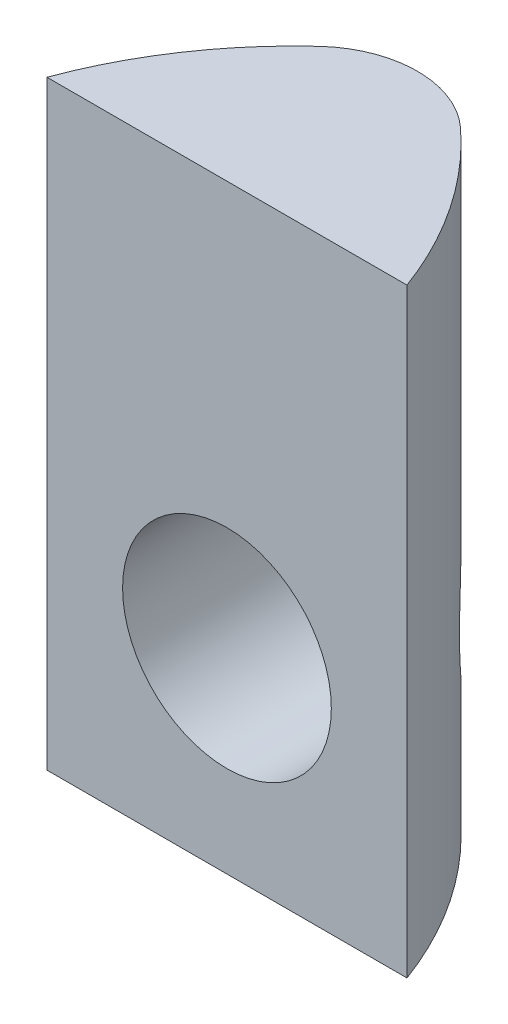
ISO-10303-21;
HEADER;
FILE_DESCRIPTION(('STEP AP214'),'2;1');
FILE_NAME('part.step','',(''),(''),'','','');
FILE_SCHEMA(('AUTOMOTIVE_DESIGN { 1 0 10303 214 1 1 1 1 }'));
ENDSEC;
DATA;
#1=APPLICATION_CONTEXT('core data for automotive mechanical design processes');
#2=APPLICATION_PROTOCOL_DEFINITION('international standard','automotive_design',2000,#1);
#3=PRODUCT_CONTEXT('',#1,'mechanical');
#4=PRODUCT('Part','Part','',(#3));
#5=PRODUCT_RELATED_PRODUCT_CATEGORY('part','',(#4));
#6=PRODUCT_DEFINITION_FORMATION('','',#4);
#7=PRODUCT_DEFINITION_CONTEXT('part definition',#1,'design');
#8=PRODUCT_DEFINITION('design','',#6,#7);
#9=PRODUCT_DEFINITION_SHAPE('','',#8);
#10=(LENGTH_UNIT() NAMED_UNIT(*) SI_UNIT(.MILLI.,.METRE.));
#11=(NAMED_UNIT(*) PLANE_ANGLE_UNIT() SI_UNIT($,.RADIAN.));
#12=(NAMED_UNIT(*) SI_UNIT($,.STERADIAN.) SOLID_ANGLE_UNIT());
#13=UNCERTAINTY_MEASURE_WITH_UNIT(LENGTH_MEASURE(1.E-05),#10,'distance_accuracy_value','');
#14=(GEOMETRIC_REPRESENTATION_CONTEXT(3) GLOBAL_UNCERTAINTY_ASSIGNED_CONTEXT((#13)) GLOBAL_UNIT_ASSIGNED_CONTEXT((#10,
#11,#12)) REPRESENTATION_CONTEXT('',''));
#15=CARTESIAN_POINT('',(0.,0.,0.));
#16=DIRECTION('',(0.,0.,1.));
#17=DIRECTION('',(1.,0.,0.));
#18=AXIS2_PLACEMENT_3D('',#15,#16,#17);
#19=CARTESIAN_POINT('',(8.10883938059988,15.5,5.54738866054847));
#20=DIRECTION('',(0.,-1.,0.));
#21=DIRECTION('',(0.,0.,-1.));
#22=AXIS2_PLACEMENT_3D('',#19,#20,#21);
#23=CYLINDRICAL_SURFACE('',#22,16.0012118447341);
#24=CARTESIAN_POINT('',(8.10883938059988,15.5,5.54738866054847));
#25=DIRECTION('',(0.,-1.,0.));
#26=DIRECTION('',(0.,0.,-1.));
#27=AXIS2_PLACEMENT_3D('',#24,#25,#26);
#28=CIRCLE('',#27,16.0012118447341);
#29=CARTESIAN_POINT('',(-6.89999999988221,15.5,2.10522700212147E-11));
#30=VERTEX_POINT('',#29);
#31=CARTESIAN_POINT('',(-2.70267351764021,15.5,-6.24879586459552));
#32=VERTEX_POINT('',#31);
#33=EDGE_CURVE('E93',#30,#32,#28,.T.);
#34=ORIENTED_EDGE('',*,*,#33,.T.);
#35=DIRECTION('',(0.,-1.,0.));
#36=VECTOR('',#35,1.);
#37=CARTESIAN_POINT('',(-2.70267351764021,15.5,-6.24879586459552));
#38=LINE('',#37,#36);
#39=CARTESIAN_POINT('',(-2.70267351764022,2.94882279173336,-6.24879586459551));
#40=VERTEX_POINT('',#39);
#41=EDGE_CURVE('E161',#32,#40,#38,.T.);
#42=ORIENTED_EDGE('',*,*,#41,.T.);
#43=CARTESIAN_POINT('',(-3.287340885616E-09,-3.99999999999999,-8.24701253509529));
#44=CARTESIAN_POINT('',(-0.147341921067703,-3.99999249556266,-8.16043426596502));
#45=CARTESIAN_POINT('',(-0.293194172534511,-3.9918615991455,-8.07148817515861));
#46=CARTESIAN_POINT('',(-0.580696965481446,-3.96026480061841,-7.88984953927804));
#47=CARTESIAN_POINT('',(-0.722350809706096,-3.9368113060517,-7.79716008233623));
#48=CARTESIAN_POINT('',(-1.00029883530273,-3.87551729821107,-7.6090010425852));
#49=CARTESIAN_POINT('',(-1.13659962608308,-3.83769518418507,-7.51353515880487));
#50=CARTESIAN_POINT('',(-1.40324218732139,-3.74842395350727,-7.32063936718334));
#51=CARTESIAN_POINT('',(-1.53358305059144,-3.69697277035562,-7.22320916357474));
#52=CARTESIAN_POINT('',(-1.77674876389576,-3.58601045103693,-7.03575307062682));
#53=CARTESIAN_POINT('',(-1.89011956544848,-3.52756045152293,-6.94580409882415));
#54=CARTESIAN_POINT('',(-2.11079342729062,-3.40011558193147,-6.76594331629057));
#55=CARTESIAN_POINT('',(-2.21809678630457,-3.33112123161506,-6.67603150394687));
#56=CARTESIAN_POINT('',(-2.42620312385422,-3.18274692400836,-6.4971323301391));
#57=CARTESIAN_POINT('',(-2.52700357875337,-3.10336297050493,-6.40814533868339));
#58=CARTESIAN_POINT('',(-2.72147885070942,-2.93430480702846,-6.23226315640392));
#59=CARTESIAN_POINT('',(-2.81515513763224,-2.8446327293423,-6.14536753662885));
#60=CARTESIAN_POINT('',(-3.04443761072605,-2.60242407760311,-5.92780254701866));
#61=CARTESIAN_POINT('',(-3.17462778683841,-2.44252019064399,-5.79946258878729));
#62=CARTESIAN_POINT('',(-3.41267299857621,-2.0970248129716,-5.55766491445157));
#63=CARTESIAN_POINT('',(-3.52057296167341,-1.91148627637457,-5.44417743484924));
#64=CARTESIAN_POINT('',(-3.68305772973307,-1.56863945444117,-5.26927161271409));
#65=CARTESIAN_POINT('',(-3.74416060049222,-1.41739001838378,-5.20208813334109));
#66=CARTESIAN_POINT('',(-3.84871930064445,-1.10216849180274,-5.0856605446179));
#67=CARTESIAN_POINT('',(-3.89219200823345,-0.938208749481262,-5.03639928214667));
#68=CARTESIAN_POINT('',(-3.94196270102343,-0.684484154814112,-4.9796042606764));
#69=CARTESIAN_POINT('',(-3.95601664566853,-0.59807070794513,-4.9634779726225));
#70=CARTESIAN_POINT('',(-3.97847894621796,-0.423584674575845,-4.93763944850119));
#71=CARTESIAN_POINT('',(-3.98689035766619,-0.335513012640703,-4.92792374102381));
#72=CARTESIAN_POINT('',(-3.99783807784642,-0.158563717540683,-4.91526941932273));
#73=CARTESIAN_POINT('',(-4.00037759980254,-0.0696865519107466,-4.91232709856013));
#74=CARTESIAN_POINT('',(-3.99953078801288,0.107972102444355,-4.91330653937735));
#75=CARTESIAN_POINT('',(-3.99614512181398,0.196753600820072,-4.91722752771918));
#76=CARTESIAN_POINT('',(-3.97913407580123,0.434612212886048,-4.93688524541506));
#77=CARTESIAN_POINT('',(-3.96003919269115,0.582844375345112,-4.95892647857697));
#78=CARTESIAN_POINT('',(-3.90643244429561,0.872705045045752,-5.02018576853696));
#79=CARTESIAN_POINT('',(-3.87191031971662,1.01432908848025,-5.05941525538217));
#80=CARTESIAN_POINT('',(-3.77418020538334,1.33940828735032,-5.16894359237582));
#81=CARTESIAN_POINT('',(-3.70508782346502,1.51901789428938,-5.24536542883216));
#82=CARTESIAN_POINT('',(-3.54645380233217,1.85961271460088,-5.41648420012362));
#83=CARTESIAN_POINT('',(-3.45686527416673,2.02055392802518,-5.51122296031448));
#84=CARTESIAN_POINT('',(-3.28984447592442,2.27883518542387,-5.68286785386482));
#85=CARTESIAN_POINT('',(-3.21659816751849,2.38095041640104,-5.75681277118879));
#86=CARTESIAN_POINT('',(-3.06262544898029,2.57599932918617,-5.90900096775918));
#87=CARTESIAN_POINT('',(-2.98189602878847,2.66892928491475,-5.98724597150533));
#88=CARTESIAN_POINT('',(-2.81359499999945,2.84580404954932,-6.14674072554326));
#89=CARTESIAN_POINT('',(-2.72601590917039,2.92973878855592,-6.22799370911879));
#90=CARTESIAN_POINT('',(-2.54466908568491,3.0885566251258,-6.39231583616425));
#91=CARTESIAN_POINT('',(-2.45090213659697,3.16344086536636,-6.47538474879559));
#92=CARTESIAN_POINT('',(-2.15566772616065,3.37838146838261,-6.73053099035524));
#93=CARTESIAN_POINT('',(-1.94479942230129,3.50399242693666,-6.90419009647079));
#94=CARTESIAN_POINT('',(-1.50254019356279,3.71513840635044,-7.24864978513357));
#95=CARTESIAN_POINT('',(-1.27119130678345,3.80075335330108,-7.41945540521117));
#96=CARTESIAN_POINT('',(-0.866406558486884,3.90876708737851,-7.70116690797834));
#97=CARTESIAN_POINT('',(-0.697418746800075,3.94255481693312,-7.81413650305825));
#98=CARTESIAN_POINT('',(-0.439179206094053,3.97676694242798,-7.97964504269513));
#99=CARTESIAN_POINT('',(-0.352256135466812,3.98542630126375,-8.03418649151533));
#100=CARTESIAN_POINT('',(-0.177065860398693,3.99704313015473,-8.14177302493241));
#101=CARTESIAN_POINT('',(-0.0887981243259551,3.99999828273276,-8.19481749272277));
#102=CARTESIAN_POINT('',(-3.28734002690657E-09,3.99999999999999,-8.24701253509529));
#103=B_SPLINE_CURVE_WITH_KNOTS('',3,(#43,#44,#45,#46,#47,#48,#49,#50,#51,#52,#53,#54,#55,#56,
#57,#58,#59,#60,#61,#62,#63,#64,#65,#66,#67,#68,#69,#70,#71,#72,#73,#74,#75,#76,#77,#78,#79,#80,
#81,#82,#83,#84,#85,#86,#87,#88,#89,#90,#91,#92,#93,#94,#95,#96,#97,#98,#99,#100,#101,#102),
.UNSPECIFIED.,.F.,.F.,(4,2,2,2,2,2,2,2,2,2,2,2,2,2,2,2,2,2,2,2,2,2,2,2,2,2,2,2,2,4),(0.,
0.512351494362662,1.02428862314785,1.53557240585329,2.04693375608957,2.51469848386754,
2.98244016162341,3.4503622812267,3.91818759524206,4.64438766167448,5.36910942447752,
5.8966012976879,6.42358697884878,6.6902921531306,6.95685278441892,7.22326751344428,
7.489652229436,7.94061008092929,8.39186827190571,9.00962315097971,9.62880565299943,
10.0657007581551,10.5027723720774,10.9403282741845,11.3778288745153,12.2762034937277,
13.1727750830014,13.7896527671802,14.0984393133911,14.4073512855152),.UNSPECIFIED.);
#104=CARTESIAN_POINT('',(-2.70267351764022,-2.94882279173337,-6.24879586459551));
#105=VERTEX_POINT('',#104);
#106=EDGE_CURVE('E114',#105,#40,#103,.T.);
#107=ORIENTED_EDGE('',*,*,#106,.F.);
#108=DIRECTION('',(0.,-1.,0.));
#109=VECTOR('',#108,1.);
#110=CARTESIAN_POINT('',(-2.70267351764021,15.5,-6.24879586459552));
#111=LINE('',#110,#109);
#112=CARTESIAN_POINT('',(-2.70267351764022,-7.5,-6.24879586459552));
#113=VERTEX_POINT('',#112);
#114=EDGE_CURVE('E124',#105,#113,#111,.T.);
#115=ORIENTED_EDGE('',*,*,#114,.T.);
#116=CARTESIAN_POINT('',(8.10883938059988,-7.5,5.54738866054847));
#117=DIRECTION('',(0.,-1.,0.));
#118=DIRECTION('',(0.,0.,-1.));
#119=AXIS2_PLACEMENT_3D('',#116,#117,#118);
#120=CIRCLE('',#119,16.0012118447341);
#121=CARTESIAN_POINT('',(-6.89999999988221,-7.5,2.10536864229328E-11));
#122=VERTEX_POINT('',#121);
#123=EDGE_CURVE('E108',#122,#113,#120,.T.);
#124=ORIENTED_EDGE('',*,*,#123,.F.);
#125=DIRECTION('',(0.,-1.,0.));
#126=VECTOR('',#125,1.);
#127=CARTESIAN_POINT('',(-6.89999999988221,15.5,2.10522700212147E-11));
#128=LINE('',#127,#126);
#129=EDGE_CURVE('E100',#30,#122,#128,.T.);
#130=ORIENTED_EDGE('',*,*,#129,.F.);
#131=EDGE_LOOP('',(#34,#42,#107,#115,#124,#130));
#132=FACE_BOUND('',#131,.T.);
#133=ADVANCED_FACE('F34',(#132),#23,.T.);
#134=CARTESIAN_POINT('',(6.90000000000389,15.5,2.10522700212147E-11));
#135=DIRECTION('',(0.,0.,1.));
#136=DIRECTION('',(0.,-1.,0.));
#137=AXIS2_PLACEMENT_3D('',#134,#135,#136);
#138=PLANE('',#137);
#139=CARTESIAN_POINT('',(0.,0.,0.));
#140=DIRECTION('',(0.,0.,1.));
#141=DIRECTION('',(1.,0.,0.));
#142=AXIS2_PLACEMENT_3D('',#139,#140,#141);
#143=CIRCLE('',#142,3.99999999999999);
#144=CARTESIAN_POINT('',(3.99999999999999,0.,0.));
#145=VERTEX_POINT('',#144);
#146=EDGE_CURVE('E144',#145,#145,#143,.T.);
#147=ORIENTED_EDGE('',*,*,#146,.F.);
#148=EDGE_LOOP('',(#147));
#149=FACE_BOUND('',#148,.T.);
#150=DIRECTION('',(-1.,0.,0.));
#151=VECTOR('',#150,1.);
#152=CARTESIAN_POINT('',(6.90000000000389,-7.5,2.10536864229328E-11));
#153=LINE('',#152,#151);
#154=CARTESIAN_POINT('',(6.90000000000389,-7.5,2.10536864229328E-11));
#155=VERTEX_POINT('',#154);
#156=EDGE_CURVE('E99',#155,#122,#153,.T.);
#157=ORIENTED_EDGE('',*,*,#156,.F.);
#158=DIRECTION('',(0.,-1.,0.));
#159=VECTOR('',#158,1.);
#160=CARTESIAN_POINT('',(6.90000000000389,15.5,2.10522700212147E-11));
#161=LINE('',#160,#159);
#162=CARTESIAN_POINT('',(6.90000000000389,15.5,2.10522700212147E-11));
#163=VERTEX_POINT('',#162);
#164=EDGE_CURVE('E87',#163,#155,#161,.T.);
#165=ORIENTED_EDGE('',*,*,#164,.F.);
#166=DIRECTION('',(-1.,0.,0.));
#167=VECTOR('',#166,1.);
#168=CARTESIAN_POINT('',(6.90000000000389,15.5,2.10522700212147E-11));
#169=LINE('',#168,#167);
#170=EDGE_CURVE('E92',#163,#30,#169,.T.);
#171=ORIENTED_EDGE('',*,*,#170,.T.);
#172=ORIENTED_EDGE('',*,*,#129,.T.);
#173=EDGE_LOOP('',(#157,#165,#171,#172));
#174=FACE_BOUND('',#173,.T.);
#175=ADVANCED_FACE('F97',(#149,#174),#138,.T.);
#176=CARTESIAN_POINT('',(-8.10883936000171,15.5,5.54738865000064));
#177=DIRECTION('',(0.,-1.,0.));
#178=DIRECTION('',(0.,0.,-1.));
#179=AXIS2_PLACEMENT_3D('',#176,#177,#178);
#180=CYLINDRICAL_SURFACE('',#179,16.0012118218707);
#181=CARTESIAN_POINT('',(-3.28734435506295E-09,3.99999999999999,-8.24701253509528));
#182=CARTESIAN_POINT('',(0.147341914609234,3.99999249580503,-8.16043426612091));
#183=CARTESIAN_POINT('',(0.293194166201951,3.99186159961459,-8.07148817545884));
#184=CARTESIAN_POINT('',(0.580696959412645,3.96026480151214,-7.88984953984528));
#185=CARTESIAN_POINT('',(0.722350803775159,3.93681130714347,-7.79716008302619));
#186=CARTESIAN_POINT('',(1.00029882964118,3.87551729967549,-7.60900104350794));
#187=CARTESIAN_POINT('',(1.13659962055353,3.83769518582546,-7.51353515983799));
#188=CARTESIAN_POINT('',(1.40324218205941,3.7484239554799,-7.32063936841743));
#189=CARTESIAN_POINT('',(1.53358304546504,3.6969727724845,-7.22320916489943));
#190=CARTESIAN_POINT('',(1.77674875886089,3.58601045352696,-7.03575307223674));
#191=CARTESIAN_POINT('',(1.89011956037764,3.52756045423493,-6.9458041006314));
#192=CARTESIAN_POINT('',(2.11079342216555,3.40011558510787,-6.76594331847516));
#193=CARTESIAN_POINT('',(2.21809678116127,3.33112123503392,-6.6760315063115));
#194=CARTESIAN_POINT('',(2.4262031186975,3.18274692793328,-6.49713233283873));
#195=CARTESIAN_POINT('',(2.52700357360128,3.10336297469315,-6.40814534153801));
#196=CARTESIAN_POINT('',(2.72147884559011,2.93430481176906,-6.23226315953867));
#197=CARTESIAN_POINT('',(2.81515513254104,2.84463273437192,-6.14536753988876));
#198=CARTESIAN_POINT('',(3.04443760624725,2.60242408287664,-5.92780255006942));
#199=CARTESIAN_POINT('',(3.17462778289734,2.44252019580266,-5.79946259150459));
#200=CARTESIAN_POINT('',(3.41267299563804,2.09702481779535,-5.55766491648376));
#201=CARTESIAN_POINT('',(3.52057295920059,1.91148628097855,-5.44417743652979));
#202=CARTESIAN_POINT('',(3.68305772791485,1.56863945872439,-5.26927161388002));
#203=CARTESIAN_POINT('',(3.74416059889963,1.41739002260762,-5.20208813432642));
#204=CARTESIAN_POINT('',(3.84871929948672,1.10216849586719,-5.08566054522768));
#205=CARTESIAN_POINT('',(3.89219200728492,0.938208753445727,-5.03639928256153));
#206=CARTESIAN_POINT('',(3.94196270037014,0.684484158587025,-4.97960426079955));
#207=CARTESIAN_POINT('',(3.95601664511119,0.598070711645055,-4.96347797264781));
#208=CARTESIAN_POINT('',(3.97847894584299,0.423584678116534,-4.93763944833565));
#209=CARTESIAN_POINT('',(3.98689035737765,0.335513016095154,-4.92792374076524));
#210=CARTESIAN_POINT('',(3.99783807771885,0.158563720810838,-4.91526941888669));
#211=CARTESIAN_POINT('',(4.00037759974956,0.0696865550828574,-4.91232709803958));
#212=CARTESIAN_POINT('',(3.99953078809524,-0.10797209947879,-4.91330653869951));
#213=CARTESIAN_POINT('',(3.99614512195708,-0.196753597963008,-4.91722752696857));
#214=CARTESIAN_POINT('',(3.97913407609236,-0.434612210257971,-4.93688524448163));
#215=CARTESIAN_POINT('',(3.96003919306344,-0.582844372846044,-4.95892647753727));
#216=CARTESIAN_POINT('',(3.90643244479813,-0.872705042816907,-5.02018576731375));
#217=CARTESIAN_POINT('',(3.87191032026817,-1.01432908639261,-5.05941525408174));
#218=CARTESIAN_POINT('',(3.77418020608384,-1.33940828536635,-5.16894359084734));
#219=CARTESIAN_POINT('',(3.70508782428297,-1.51901789228807,-5.24536542713263));
#220=CARTESIAN_POINT('',(3.54645380338164,-1.85961271259417,-5.41648419808288));
#221=CARTESIAN_POINT('',(3.45686527533037,-2.02055392603061,-5.51122295810348));
#222=CARTESIAN_POINT('',(3.28984447729538,-2.2788351834413,-5.68286785135036));
#223=CARTESIAN_POINT('',(3.21659816898606,-2.38095041441542,-5.75681276853828));
#224=CARTESIAN_POINT('',(3.06262545064191,-2.57599932720789,-5.90900096483766));
#225=CARTESIAN_POINT('',(2.98189603054755,-2.66892928294687,-5.98724596844884));
#226=CARTESIAN_POINT('',(2.81359500195396,-2.84580404761455,-6.14674072221865));
#227=CARTESIAN_POINT('',(2.72601591122287,-2.92973878664389,-6.22799370566103));
#228=CARTESIAN_POINT('',(2.54466908793349,-3.08855662327106,-6.39231583244258));
#229=CARTESIAN_POINT('',(2.45090213894369,-3.16344086354616,-6.47538474494317));
#230=CARTESIAN_POINT('',(2.15566772880879,-3.37838146668435,-6.73053098610581));
#231=CARTESIAN_POINT('',(1.94479942515273,-3.50399242534507,-6.90419009195927));
#232=CARTESIAN_POINT('',(1.50254019681742,-3.71513840502622,-7.24864978011153));
#233=CARTESIAN_POINT('',(1.27119131023784,-3.80075335213719,-7.41945539994065));
#234=CARTESIAN_POINT('',(0.866406560569258,-3.90876708698924,-7.70116690348413));
#235=CARTESIAN_POINT('',(0.697418747234066,-3.94255481693178,-7.81413649954509));
#236=CARTESIAN_POINT('',(0.439179203962405,-3.97676694268227,-7.97964504056863));
#237=CARTESIAN_POINT('',(0.352256132461304,-3.98542630154882,-8.03418648983866));
#238=CARTESIAN_POINT('',(0.177065855623166,-3.99704313038563,-8.14177302412117));
#239=CARTESIAN_POINT('',(0.0887981186542512,-3.99999828287864,-8.19481749232709));
#240=CARTESIAN_POINT('',(-3.28734359051469E-09,-3.99999999999999,-8.24701253509528));
#241=B_SPLINE_CURVE_WITH_KNOTS('',3,(#181,#182,#183,#184,#185,#186,#187,#188,#189,#190,#191,
#192,#193,#194,#195,#196,#197,#198,#199,#200,#201,#202,#203,#204,#205,#206,#207,#208,#209,#210,
#211,#212,#213,#214,#215,#216,#217,#218,#219,#220,#221,#222,#223,#224,#225,#226,#227,#228,#229,
#230,#231,#232,#233,#234,#235,#236,#237,#238,#239,#240),.UNSPECIFIED.,.F.,.F.,(4,2,2,2,2,2,2,2,
2,2,2,2,2,2,2,2,2,2,2,2,2,2,2,2,2,2,2,2,2,4),(0.,0.512351494424845,1.02428862326905,
1.53557240598675,2.04693375623555,2.51469848334596,2.98244016043308,3.45036227938078,
3.91818759274273,4.64438766078441,5.36910942519205,5.89660129899612,6.4235869807511,
6.69029215534354,6.95685278694198,7.22326751627478,7.48965223257361,7.9406100843647,
8.39186827564,9.00962315436452,9.62880565603067,10.0657007608278,10.5027723743914,
10.9403282761394,11.3778288761114,12.2762034945779,13.1727750831134,13.7896527731102,
14.0984393222516,14.4073512973091),.UNSPECIFIED.);
#242=CARTESIAN_POINT('',(2.70267351361543,2.94882279542414,-6.24879586669763));
#243=VERTEX_POINT('',#242);
#244=CARTESIAN_POINT('',(2.70267351361511,-2.94882279542248,-6.24879586669769));
#245=VERTEX_POINT('',#244);
#246=EDGE_CURVE('E111',#243,#245,#241,.T.);
#247=ORIENTED_EDGE('',*,*,#246,.F.);
#248=DIRECTION('',(0.,-1.,0.));
#249=VECTOR('',#248,1.);
#250=CARTESIAN_POINT('',(2.70267351361511,15.5,-6.24879586669769));
#251=LINE('',#250,#249);
#252=CARTESIAN_POINT('',(2.70267351361511,15.5,-6.24879586669769));
#253=VERTEX_POINT('',#252);
#254=EDGE_CURVE('E55',#243,#253,#251,.F.);
#255=ORIENTED_EDGE('',*,*,#254,.T.);
#256=CARTESIAN_POINT('',(-8.10883936000171,15.5,5.54738865000064));
#257=DIRECTION('',(0.,-1.,0.));
#258=DIRECTION('',(0.,0.,-1.));
#259=AXIS2_PLACEMENT_3D('',#256,#257,#258);
#260=CIRCLE('',#259,16.0012118218707);
#261=EDGE_CURVE('E84',#253,#163,#260,.T.);
#262=ORIENTED_EDGE('',*,*,#261,.T.);
#263=ORIENTED_EDGE('',*,*,#164,.T.);
#264=CARTESIAN_POINT('',(-8.10883936000171,-7.5,5.54738865000064));
#265=DIRECTION('',(0.,-1.,0.));
#266=DIRECTION('',(0.,0.,-1.));
#267=AXIS2_PLACEMENT_3D('',#264,#265,#266);
#268=CIRCLE('',#267,16.0012118218707);
#269=CARTESIAN_POINT('',(2.70267351361511,-7.5,-6.24879586669769));
#270=VERTEX_POINT('',#269);
#271=EDGE_CURVE('E110',#270,#155,#268,.T.);
#272=ORIENTED_EDGE('',*,*,#271,.F.);
#273=DIRECTION('',(0.,-1.,0.));
#274=VECTOR('',#273,1.);
#275=CARTESIAN_POINT('',(2.70267351361511,15.5,-6.24879586669769));
#276=LINE('',#275,#274);
#277=EDGE_CURVE('E170',#270,#245,#276,.F.);
#278=ORIENTED_EDGE('',*,*,#277,.T.);
#279=EDGE_LOOP('',(#247,#255,#262,#263,#272,#278));
#280=FACE_BOUND('',#279,.T.);
#281=ADVANCED_FACE('F86',(#280),#180,.T.);
#282=CARTESIAN_POINT('',(8.10883938059988,15.5,5.54738866054847));
#283=DIRECTION('',(0.,-1.,0.));
#284=DIRECTION('',(0.,0.,-1.));
#285=AXIS2_PLACEMENT_3D('',#282,#283,#284);
#286=PLANE('',#285);
#287=ORIENTED_EDGE('',*,*,#261,.F.);
#288=CARTESIAN_POINT('',(-8.65736949896466E-10,15.5,-3.29997308510448));
#289=DIRECTION('',(0.,-1.,0.));
#290=DIRECTION('',(0.,0.,-1.));
#291=AXIS2_PLACEMENT_3D('',#288,#289,#290);
#292=CIRCLE('',#291,3.99999999038992);
#293=EDGE_CURVE('E42',#253,#32,#292,.F.);
#294=ORIENTED_EDGE('',*,*,#293,.T.);
#295=ORIENTED_EDGE('',*,*,#33,.F.);
#296=ORIENTED_EDGE('',*,*,#170,.F.);
#297=EDGE_LOOP('',(#287,#294,#295,#296));
#298=FACE_BOUND('',#297,.T.);
#299=ADVANCED_FACE('F103',(#298),#286,.F.);
#300=CARTESIAN_POINT('',(8.10883938059988,-7.5,5.54738866054847));
#301=DIRECTION('',(0.,-1.,0.));
#302=DIRECTION('',(0.,0.,-1.));
#303=AXIS2_PLACEMENT_3D('',#300,#301,#302);
#304=PLANE('',#303);
#305=ORIENTED_EDGE('',*,*,#123,.T.);
#306=CARTESIAN_POINT('',(-8.65736949896466E-10,-7.5,-3.29997308510447));
#307=DIRECTION('',(0.,-1.,0.));
#308=DIRECTION('',(0.,0.,-1.));
#309=AXIS2_PLACEMENT_3D('',#306,#307,#308);
#310=CIRCLE('',#309,3.99999999038992);
#311=EDGE_CURVE('E11',#113,#270,#310,.T.);
#312=ORIENTED_EDGE('',*,*,#311,.T.);
#313=ORIENTED_EDGE('',*,*,#271,.T.);
#314=ORIENTED_EDGE('',*,*,#156,.T.);
#315=EDGE_LOOP('',(#305,#312,#313,#314));
#316=FACE_BOUND('',#315,.T.);
#317=ADVANCED_FACE('F133',(#316),#304,.T.);
#318=CARTESIAN_POINT('',(0.,0.,0.));
#319=DIRECTION('',(0.,0.,1.));
#320=DIRECTION('',(1.,0.,0.));
#321=AXIS2_PLACEMENT_3D('',#318,#319,#320);
#322=CYLINDRICAL_SURFACE('',#321,3.99999999999999);
#323=ORIENTED_EDGE('',*,*,#106,.T.);
#324=CARTESIAN_POINT('',(-4.32868474948233E-10,0.,-3.29997308510447));
#325=DIRECTION('',(0.,-0.707106781186548,-0.707106781186547));
#326=DIRECTION('',(0.,-0.707106781186547,0.707106781186547));
#327=AXIS2_PLACEMENT_3D('',#324,#325,#326);
#328=ELLIPSE('',#327,5.65685424269702,3.99999999519495);
#329=EDGE_CURVE('E164',#40,#243,#328,.T.);
#330=ORIENTED_EDGE('',*,*,#329,.T.);
#331=ORIENTED_EDGE('',*,*,#246,.T.);
#332=CARTESIAN_POINT('',(-4.32868474948233E-10,0.,-3.29997308510447));
#333=DIRECTION('',(0.,-0.707106781186547,0.707106781186547));
#334=DIRECTION('',(0.,-0.707106781186548,-0.707106781186547));
#335=AXIS2_PLACEMENT_3D('',#332,#333,#334);
#336=ELLIPSE('',#335,5.65685424269702,3.99999999519495);
#337=EDGE_CURVE('E165',#245,#105,#336,.F.);
#338=ORIENTED_EDGE('',*,*,#337,.T.);
#339=EDGE_LOOP('',(#323,#330,#331,#338));
#340=FACE_BOUND('',#339,.T.);
#341=ORIENTED_EDGE('',*,*,#146,.T.);
#342=EDGE_LOOP('',(#341));
#343=FACE_BOUND('',#342,.T.);
#344=ADVANCED_FACE('F128',(#340,#343),#322,.F.);
#345=CARTESIAN_POINT('',(-8.65736949896466E-10,15.5,-3.29997308510448));
#346=DIRECTION('',(0.,-1.,0.));
#347=DIRECTION('',(0.,0.,-1.));
#348=AXIS2_PLACEMENT_3D('',#345,#346,#347);
#349=CYLINDRICAL_SURFACE('',#348,3.99999999038992);
#350=ORIENTED_EDGE('',*,*,#293,.F.);
#351=ORIENTED_EDGE('',*,*,#254,.F.);
#352=ORIENTED_EDGE('',*,*,#329,.F.);
#353=ORIENTED_EDGE('',*,*,#41,.F.);
#354=EDGE_LOOP('',(#350,#351,#352,#353));
#355=FACE_BOUND('',#354,.T.);
#356=ADVANCED_FACE('F132',(#355),#349,.T.);
#357=CARTESIAN_POINT('',(-8.65736949896466E-10,15.5,-3.29997308510448));
#358=DIRECTION('',(0.,-1.,0.));
#359=DIRECTION('',(0.,0.,-1.));
#360=AXIS2_PLACEMENT_3D('',#357,#358,#359);
#361=CYLINDRICAL_SURFACE('',#360,3.99999999038992);
#362=ORIENTED_EDGE('',*,*,#337,.F.);
#363=ORIENTED_EDGE('',*,*,#277,.F.);
#364=ORIENTED_EDGE('',*,*,#311,.F.);
#365=ORIENTED_EDGE('',*,*,#114,.F.);
#366=EDGE_LOOP('',(#362,#363,#364,#365));
#367=FACE_BOUND('',#366,.T.);
#368=ADVANCED_FACE('F36',(#367),#361,.T.);
#369=CLOSED_SHELL('',(#133,#175,#281,#299,#317,#344,#356,#368));
#370=MANIFOLD_SOLID_BREP('B2',#369);
#371=ADVANCED_BREP_SHAPE_REPRESENTATION('',(#18,#370),#14);
#372=SHAPE_DEFINITION_REPRESENTATION(#9,#371);
ENDSEC;
END-ISO-10303-21;
